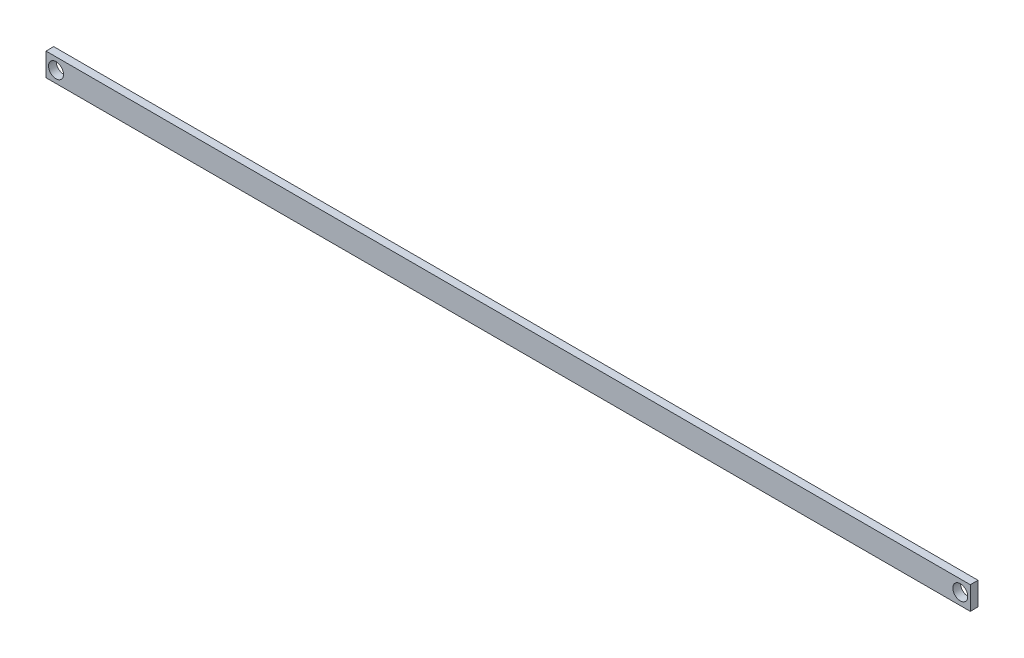
ISO-10303-21;
HEADER;
FILE_DESCRIPTION(('STEP AP214'),'2;1');
FILE_NAME('part.step','',(''),(''),'','','');
FILE_SCHEMA(('AUTOMOTIVE_DESIGN { 1 0 10303 214 1 1 1 1 }'));
ENDSEC;
DATA;
#1=APPLICATION_CONTEXT('core data for automotive mechanical design processes');
#2=APPLICATION_PROTOCOL_DEFINITION('international standard','automotive_design',2000,#1);
#3=PRODUCT_CONTEXT('',#1,'mechanical');
#4=PRODUCT('Part','Part','',(#3));
#5=PRODUCT_RELATED_PRODUCT_CATEGORY('part','',(#4));
#6=PRODUCT_DEFINITION_FORMATION('','',#4);
#7=PRODUCT_DEFINITION_CONTEXT('part definition',#1,'design');
#8=PRODUCT_DEFINITION('design','',#6,#7);
#9=PRODUCT_DEFINITION_SHAPE('','',#8);
#10=(LENGTH_UNIT() NAMED_UNIT(*) SI_UNIT(.MILLI.,.METRE.));
#11=(NAMED_UNIT(*) PLANE_ANGLE_UNIT() SI_UNIT($,.RADIAN.));
#12=(NAMED_UNIT(*) SI_UNIT($,.STERADIAN.) SOLID_ANGLE_UNIT());
#13=UNCERTAINTY_MEASURE_WITH_UNIT(LENGTH_MEASURE(1.E-05),#10,'distance_accuracy_value','');
#14=(GEOMETRIC_REPRESENTATION_CONTEXT(3) GLOBAL_UNCERTAINTY_ASSIGNED_CONTEXT((#13)) GLOBAL_UNIT_ASSIGNED_CONTEXT((#10,
#11,#12)) REPRESENTATION_CONTEXT('',''));
#15=CARTESIAN_POINT('',(0.,0.,0.));
#16=DIRECTION('',(0.,0.,1.));
#17=DIRECTION('',(1.,0.,0.));
#18=AXIS2_PLACEMENT_3D('',#15,#16,#17);
#19=CARTESIAN_POINT('',(0.,0.,-5.));
#20=DIRECTION('',(-1.,0.,0.));
#21=DIRECTION('',(0.,-1.,0.));
#22=AXIS2_PLACEMENT_3D('',#19,#20,#21);
#23=PLANE('',#22);
#24=DIRECTION('',(0.,-1.,0.));
#25=VECTOR('',#24,1.);
#26=CARTESIAN_POINT('',(0.,0.,0.));
#27=LINE('',#26,#25);
#28=CARTESIAN_POINT('',(0.,0.,0.));
#29=VERTEX_POINT('',#28);
#30=CARTESIAN_POINT('',(0.,-15.,0.));
#31=VERTEX_POINT('',#30);
#32=EDGE_CURVE('E113',#29,#31,#27,.T.);
#33=ORIENTED_EDGE('',*,*,#32,.F.);
#34=DIRECTION('',(0.,0.,1.));
#35=VECTOR('',#34,1.);
#36=CARTESIAN_POINT('',(0.,0.,-5.));
#37=LINE('',#36,#35);
#38=CARTESIAN_POINT('',(0.,0.,-5.));
#39=VERTEX_POINT('',#38);
#40=EDGE_CURVE('E11',#39,#29,#37,.T.);
#41=ORIENTED_EDGE('',*,*,#40,.F.);
#42=DIRECTION('',(0.,-1.,0.));
#43=VECTOR('',#42,1.);
#44=CARTESIAN_POINT('',(0.,0.,-5.));
#45=LINE('',#44,#43);
#46=CARTESIAN_POINT('',(0.,-15.,-5.));
#47=VERTEX_POINT('',#46);
#48=EDGE_CURVE('E107',#39,#47,#45,.T.);
#49=ORIENTED_EDGE('',*,*,#48,.T.);
#50=DIRECTION('',(0.,0.,1.));
#51=VECTOR('',#50,1.);
#52=CARTESIAN_POINT('',(0.,-15.,-5.));
#53=LINE('',#52,#51);
#54=EDGE_CURVE('E50',#47,#31,#53,.T.);
#55=ORIENTED_EDGE('',*,*,#54,.T.);
#56=EDGE_LOOP('',(#33,#41,#49,#55));
#57=FACE_BOUND('',#56,.T.);
#58=ADVANCED_FACE('F42',(#57),#23,.T.);
#59=CARTESIAN_POINT('',(0.,0.,-5.));
#60=DIRECTION('',(0.,1.,0.));
#61=DIRECTION('',(0.,0.,1.));
#62=AXIS2_PLACEMENT_3D('',#59,#60,#61);
#63=PLANE('',#62);
#64=DIRECTION('',(-1.,0.,0.));
#65=VECTOR('',#64,1.);
#66=CARTESIAN_POINT('',(0.,0.,0.));
#67=LINE('',#66,#65);
#68=CARTESIAN_POINT('',(600.,0.,0.));
#69=VERTEX_POINT('',#68);
#70=EDGE_CURVE('E106',#69,#29,#67,.T.);
#71=ORIENTED_EDGE('',*,*,#70,.F.);
#72=DIRECTION('',(0.,0.,1.));
#73=VECTOR('',#72,1.);
#74=CARTESIAN_POINT('',(600.,0.,-5.));
#75=LINE('',#74,#73);
#76=CARTESIAN_POINT('',(600.,0.,-5.));
#77=VERTEX_POINT('',#76);
#78=EDGE_CURVE('E53',#77,#69,#75,.T.);
#79=ORIENTED_EDGE('',*,*,#78,.F.);
#80=DIRECTION('',(-1.,0.,0.));
#81=VECTOR('',#80,1.);
#82=CARTESIAN_POINT('',(0.,0.,-5.));
#83=LINE('',#82,#81);
#84=EDGE_CURVE('E102',#77,#39,#83,.T.);
#85=ORIENTED_EDGE('',*,*,#84,.T.);
#86=ORIENTED_EDGE('',*,*,#40,.T.);
#87=EDGE_LOOP('',(#71,#79,#85,#86));
#88=FACE_BOUND('',#87,.T.);
#89=ADVANCED_FACE('F135',(#88),#63,.T.);
#90=CARTESIAN_POINT('',(600.,-15.,-5.));
#91=DIRECTION('',(1.,0.,0.));
#92=DIRECTION('',(0.,0.,-1.));
#93=AXIS2_PLACEMENT_3D('',#90,#91,#92);
#94=PLANE('',#93);
#95=DIRECTION('',(0.,1.,0.));
#96=VECTOR('',#95,1.);
#97=CARTESIAN_POINT('',(600.,-15.,0.));
#98=LINE('',#97,#96);
#99=CARTESIAN_POINT('',(600.,-15.,0.));
#100=VERTEX_POINT('',#99);
#101=EDGE_CURVE('E94',#100,#69,#98,.T.);
#102=ORIENTED_EDGE('',*,*,#101,.F.);
#103=DIRECTION('',(0.,0.,1.));
#104=VECTOR('',#103,1.);
#105=CARTESIAN_POINT('',(600.,-15.,-5.));
#106=LINE('',#105,#104);
#107=CARTESIAN_POINT('',(600.,-15.,-5.));
#108=VERTEX_POINT('',#107);
#109=EDGE_CURVE('E89',#108,#100,#106,.T.);
#110=ORIENTED_EDGE('',*,*,#109,.F.);
#111=DIRECTION('',(0.,1.,0.));
#112=VECTOR('',#111,1.);
#113=CARTESIAN_POINT('',(600.,-15.,-5.));
#114=LINE('',#113,#112);
#115=EDGE_CURVE('E93',#108,#77,#114,.T.);
#116=ORIENTED_EDGE('',*,*,#115,.T.);
#117=ORIENTED_EDGE('',*,*,#78,.T.);
#118=EDGE_LOOP('',(#102,#110,#116,#117));
#119=FACE_BOUND('',#118,.T.);
#120=ADVANCED_FACE('F95',(#119),#94,.T.);
#121=CARTESIAN_POINT('',(0.,-15.,-5.));
#122=DIRECTION('',(0.,-1.,0.));
#123=DIRECTION('',(0.,0.,-1.));
#124=AXIS2_PLACEMENT_3D('',#121,#122,#123);
#125=PLANE('',#124);
#126=DIRECTION('',(1.,0.,0.));
#127=VECTOR('',#126,1.);
#128=CARTESIAN_POINT('',(0.,-15.,0.));
#129=LINE('',#128,#127);
#130=EDGE_CURVE('E116',#31,#100,#129,.T.);
#131=ORIENTED_EDGE('',*,*,#130,.F.);
#132=ORIENTED_EDGE('',*,*,#54,.F.);
#133=DIRECTION('',(1.,0.,0.));
#134=VECTOR('',#133,1.);
#135=CARTESIAN_POINT('',(0.,-15.,-5.));
#136=LINE('',#135,#134);
#137=EDGE_CURVE('E99',#47,#108,#136,.T.);
#138=ORIENTED_EDGE('',*,*,#137,.T.);
#139=ORIENTED_EDGE('',*,*,#109,.T.);
#140=EDGE_LOOP('',(#131,#132,#138,#139));
#141=FACE_BOUND('',#140,.T.);
#142=ADVANCED_FACE('F101',(#141),#125,.T.);
#143=CARTESIAN_POINT('',(0.,0.,-5.));
#144=DIRECTION('',(0.,0.,1.));
#145=DIRECTION('',(1.,0.,0.));
#146=AXIS2_PLACEMENT_3D('',#143,#144,#145);
#147=PLANE('',#146);
#148=CARTESIAN_POINT('',(593.5,-7.5,-5.));
#149=DIRECTION('',(0.,0.,1.));
#150=DIRECTION('',(1.,0.,0.));
#151=AXIS2_PLACEMENT_3D('',#148,#149,#150);
#152=CIRCLE('',#151,4.84999999999997);
#153=CARTESIAN_POINT('',(598.35,-7.5,-5.));
#154=VERTEX_POINT('',#153);
#155=EDGE_CURVE('E163',#154,#154,#152,.T.);
#156=ORIENTED_EDGE('',*,*,#155,.T.);
#157=EDGE_LOOP('',(#156));
#158=FACE_BOUND('',#157,.T.);
#159=CARTESIAN_POINT('',(6.5,-7.5,-5.));
#160=DIRECTION('',(0.,0.,1.));
#161=DIRECTION('',(1.,0.,0.));
#162=AXIS2_PLACEMENT_3D('',#159,#160,#161);
#163=CIRCLE('',#162,4.85);
#164=CARTESIAN_POINT('',(11.35,-7.5,-5.));
#165=VERTEX_POINT('',#164);
#166=EDGE_CURVE('E118',#165,#165,#163,.T.);
#167=ORIENTED_EDGE('',*,*,#166,.T.);
#168=EDGE_LOOP('',(#167));
#169=FACE_BOUND('',#168,.T.);
#170=ORIENTED_EDGE('',*,*,#48,.F.);
#171=ORIENTED_EDGE('',*,*,#84,.F.);
#172=ORIENTED_EDGE('',*,*,#115,.F.);
#173=ORIENTED_EDGE('',*,*,#137,.F.);
#174=EDGE_LOOP('',(#170,#171,#172,#173));
#175=FACE_BOUND('',#174,.T.);
#176=ADVANCED_FACE('F98',(#158,#169,#175),#147,.F.);
#177=CARTESIAN_POINT('',(0.,0.,0.));
#178=DIRECTION('',(0.,0.,1.));
#179=DIRECTION('',(1.,0.,0.));
#180=AXIS2_PLACEMENT_3D('',#177,#178,#179);
#181=PLANE('',#180);
#182=CARTESIAN_POINT('',(593.5,-7.5,0.));
#183=DIRECTION('',(0.,0.,1.));
#184=DIRECTION('',(1.,0.,0.));
#185=AXIS2_PLACEMENT_3D('',#182,#183,#184);
#186=CIRCLE('',#185,4.84999999999997);
#187=CARTESIAN_POINT('',(598.35,-7.5,0.));
#188=VERTEX_POINT('',#187);
#189=EDGE_CURVE('E166',#188,#188,#186,.T.);
#190=ORIENTED_EDGE('',*,*,#189,.F.);
#191=EDGE_LOOP('',(#190));
#192=FACE_BOUND('',#191,.T.);
#193=CARTESIAN_POINT('',(6.5,-7.5,0.));
#194=DIRECTION('',(0.,0.,1.));
#195=DIRECTION('',(1.,0.,0.));
#196=AXIS2_PLACEMENT_3D('',#193,#194,#195);
#197=CIRCLE('',#196,4.85);
#198=CARTESIAN_POINT('',(11.35,-7.5,0.));
#199=VERTEX_POINT('',#198);
#200=EDGE_CURVE('E175',#199,#199,#197,.T.);
#201=ORIENTED_EDGE('',*,*,#200,.F.);
#202=EDGE_LOOP('',(#201));
#203=FACE_BOUND('',#202,.T.);
#204=ORIENTED_EDGE('',*,*,#32,.T.);
#205=ORIENTED_EDGE('',*,*,#130,.T.);
#206=ORIENTED_EDGE('',*,*,#101,.T.);
#207=ORIENTED_EDGE('',*,*,#70,.T.);
#208=EDGE_LOOP('',(#204,#205,#206,#207));
#209=FACE_BOUND('',#208,.T.);
#210=ADVANCED_FACE('F131',(#192,#203,#209),#181,.T.);
#211=CARTESIAN_POINT('',(6.5,-7.5,-5.));
#212=DIRECTION('',(0.,0.,1.));
#213=DIRECTION('',(1.,0.,0.));
#214=AXIS2_PLACEMENT_3D('',#211,#212,#213);
#215=CYLINDRICAL_SURFACE('',#214,4.85);
#216=ORIENTED_EDGE('',*,*,#166,.F.);
#217=EDGE_LOOP('',(#216));
#218=FACE_BOUND('',#217,.T.);
#219=ORIENTED_EDGE('',*,*,#200,.T.);
#220=EDGE_LOOP('',(#219));
#221=FACE_BOUND('',#220,.T.);
#222=ADVANCED_FACE('F148',(#218,#221),#215,.F.);
#223=CARTESIAN_POINT('',(593.5,-7.5,-5.));
#224=DIRECTION('',(0.,0.,1.));
#225=DIRECTION('',(1.,0.,0.));
#226=AXIS2_PLACEMENT_3D('',#223,#224,#225);
#227=CYLINDRICAL_SURFACE('',#226,4.84999999999997);
#228=ORIENTED_EDGE('',*,*,#155,.F.);
#229=EDGE_LOOP('',(#228));
#230=FACE_BOUND('',#229,.T.);
#231=ORIENTED_EDGE('',*,*,#189,.T.);
#232=EDGE_LOOP('',(#231));
#233=FACE_BOUND('',#232,.T.);
#234=ADVANCED_FACE('F160',(#230,#233),#227,.F.);
#235=CLOSED_SHELL('',(#58,#89,#120,#142,#176,#210,#222,#234));
#236=MANIFOLD_SOLID_BREP('B2',#235);
#237=ADVANCED_BREP_SHAPE_REPRESENTATION('',(#18,#236),#14);
#238=SHAPE_DEFINITION_REPRESENTATION(#9,#237);
ENDSEC;
END-ISO-10303-21;
